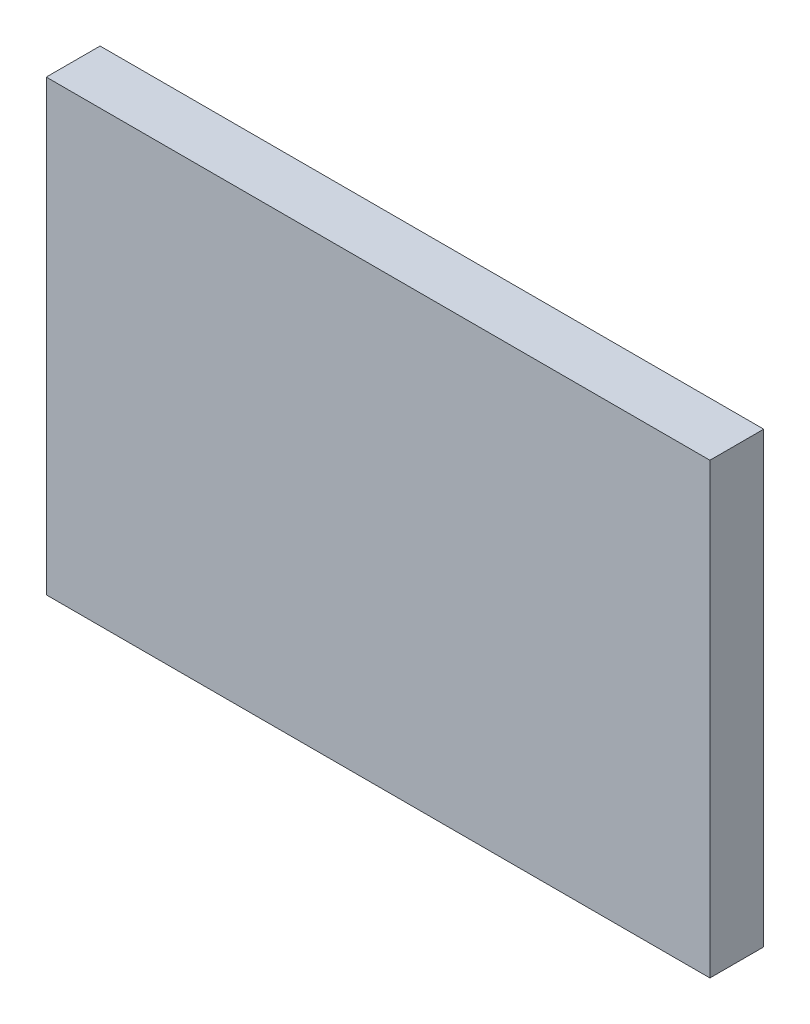
ISO-10303-21;
HEADER;
FILE_DESCRIPTION(('STEP AP214'),'2;1');
FILE_NAME('part.step','',(''),(''),'','','');
FILE_SCHEMA(('AUTOMOTIVE_DESIGN { 1 0 10303 214 1 1 1 1 }'));
ENDSEC;
DATA;
#1=APPLICATION_CONTEXT('core data for automotive mechanical design processes');
#2=APPLICATION_PROTOCOL_DEFINITION('international standard','automotive_design',2000,#1);
#3=PRODUCT_CONTEXT('',#1,'mechanical');
#4=PRODUCT('Part','Part','',(#3));
#5=PRODUCT_RELATED_PRODUCT_CATEGORY('part','',(#4));
#6=PRODUCT_DEFINITION_FORMATION('','',#4);
#7=PRODUCT_DEFINITION_CONTEXT('part definition',#1,'design');
#8=PRODUCT_DEFINITION('design','',#6,#7);
#9=PRODUCT_DEFINITION_SHAPE('','',#8);
#10=(LENGTH_UNIT() NAMED_UNIT(*) SI_UNIT(.MILLI.,.METRE.));
#11=(NAMED_UNIT(*) PLANE_ANGLE_UNIT() SI_UNIT($,.RADIAN.));
#12=(NAMED_UNIT(*) SI_UNIT($,.STERADIAN.) SOLID_ANGLE_UNIT());
#13=UNCERTAINTY_MEASURE_WITH_UNIT(LENGTH_MEASURE(1.E-05),#10,'distance_accuracy_value','');
#14=(GEOMETRIC_REPRESENTATION_CONTEXT(3) GLOBAL_UNCERTAINTY_ASSIGNED_CONTEXT((#13)) GLOBAL_UNIT_ASSIGNED_CONTEXT((#10,
#11,#12)) REPRESENTATION_CONTEXT('',''));
#15=CARTESIAN_POINT('',(0.,0.,0.));
#16=DIRECTION('',(0.,0.,1.));
#17=DIRECTION('',(1.,0.,0.));
#18=AXIS2_PLACEMENT_3D('',#15,#16,#17);
#19=CARTESIAN_POINT('',(37.,-25.,6.));
#20=DIRECTION('',(-1.,0.,0.));
#21=DIRECTION('',(0.,0.,1.));
#22=AXIS2_PLACEMENT_3D('',#19,#20,#21);
#23=PLANE('',#22);
#24=DIRECTION('',(0.,1.,0.));
#25=VECTOR('',#24,1.);
#26=CARTESIAN_POINT('',(37.,-25.,0.));
#27=LINE('',#26,#25);
#28=CARTESIAN_POINT('',(37.,-25.,0.));
#29=VERTEX_POINT('',#28);
#30=CARTESIAN_POINT('',(37.,25.,0.));
#31=VERTEX_POINT('',#30);
#32=EDGE_CURVE('E96',#29,#31,#27,.T.);
#33=ORIENTED_EDGE('',*,*,#32,.T.);
#34=DIRECTION('',(0.,0.,-1.));
#35=VECTOR('',#34,1.);
#36=CARTESIAN_POINT('',(37.,25.,6.));
#37=LINE('',#36,#35);
#38=CARTESIAN_POINT('',(37.,25.,6.));
#39=VERTEX_POINT('',#38);
#40=EDGE_CURVE('E11',#39,#31,#37,.T.);
#41=ORIENTED_EDGE('',*,*,#40,.F.);
#42=DIRECTION('',(0.,1.,0.));
#43=VECTOR('',#42,1.);
#44=CARTESIAN_POINT('',(37.,-25.,6.));
#45=LINE('',#44,#43);
#46=CARTESIAN_POINT('',(37.,-25.,6.));
#47=VERTEX_POINT('',#46);
#48=EDGE_CURVE('E84',#47,#39,#45,.T.);
#49=ORIENTED_EDGE('',*,*,#48,.F.);
#50=DIRECTION('',(0.,0.,-1.));
#51=VECTOR('',#50,1.);
#52=CARTESIAN_POINT('',(37.,-25.,6.));
#53=LINE('',#52,#51);
#54=EDGE_CURVE('E92',#47,#29,#53,.T.);
#55=ORIENTED_EDGE('',*,*,#54,.T.);
#56=EDGE_LOOP('',(#33,#41,#49,#55));
#57=FACE_BOUND('',#56,.T.);
#58=ADVANCED_FACE('F33',(#57),#23,.F.);
#59=CARTESIAN_POINT('',(-37.,25.,6.));
#60=DIRECTION('',(0.,-1.,0.));
#61=DIRECTION('',(0.,0.,-1.));
#62=AXIS2_PLACEMENT_3D('',#59,#60,#61);
#63=PLANE('',#62);
#64=DIRECTION('',(-1.,0.,0.));
#65=VECTOR('',#64,1.);
#66=CARTESIAN_POINT('',(-37.,25.,0.));
#67=LINE('',#66,#65);
#68=CARTESIAN_POINT('',(-37.,25.,0.));
#69=VERTEX_POINT('',#68);
#70=EDGE_CURVE('E88',#31,#69,#67,.T.);
#71=ORIENTED_EDGE('',*,*,#70,.T.);
#72=DIRECTION('',(0.,0.,-1.));
#73=VECTOR('',#72,1.);
#74=CARTESIAN_POINT('',(-37.,25.,6.));
#75=LINE('',#74,#73);
#76=CARTESIAN_POINT('',(-37.,25.,6.));
#77=VERTEX_POINT('',#76);
#78=EDGE_CURVE('E41',#77,#69,#75,.T.);
#79=ORIENTED_EDGE('',*,*,#78,.F.);
#80=DIRECTION('',(-1.,0.,0.));
#81=VECTOR('',#80,1.);
#82=CARTESIAN_POINT('',(-37.,25.,6.));
#83=LINE('',#82,#81);
#84=EDGE_CURVE('E79',#39,#77,#83,.T.);
#85=ORIENTED_EDGE('',*,*,#84,.F.);
#86=ORIENTED_EDGE('',*,*,#40,.T.);
#87=EDGE_LOOP('',(#71,#79,#85,#86));
#88=FACE_BOUND('',#87,.T.);
#89=ADVANCED_FACE('F87',(#88),#63,.F.);
#90=CARTESIAN_POINT('',(-37.,-25.,6.));
#91=DIRECTION('',(1.,0.,0.));
#92=DIRECTION('',(0.,0.,-1.));
#93=AXIS2_PLACEMENT_3D('',#90,#91,#92);
#94=PLANE('',#93);
#95=DIRECTION('',(0.,-1.,0.));
#96=VECTOR('',#95,1.);
#97=CARTESIAN_POINT('',(-37.,-25.,0.));
#98=LINE('',#97,#96);
#99=CARTESIAN_POINT('',(-37.,-25.,0.));
#100=VERTEX_POINT('',#99);
#101=EDGE_CURVE('E66',#69,#100,#98,.T.);
#102=ORIENTED_EDGE('',*,*,#101,.T.);
#103=DIRECTION('',(0.,0.,-1.));
#104=VECTOR('',#103,1.);
#105=CARTESIAN_POINT('',(-37.,-25.,6.));
#106=LINE('',#105,#104);
#107=CARTESIAN_POINT('',(-37.,-25.,6.));
#108=VERTEX_POINT('',#107);
#109=EDGE_CURVE('E89',#108,#100,#106,.T.);
#110=ORIENTED_EDGE('',*,*,#109,.F.);
#111=DIRECTION('',(0.,-1.,0.));
#112=VECTOR('',#111,1.);
#113=CARTESIAN_POINT('',(-37.,-25.,6.));
#114=LINE('',#113,#112);
#115=EDGE_CURVE('E82',#77,#108,#114,.T.);
#116=ORIENTED_EDGE('',*,*,#115,.F.);
#117=ORIENTED_EDGE('',*,*,#78,.T.);
#118=EDGE_LOOP('',(#102,#110,#116,#117));
#119=FACE_BOUND('',#118,.T.);
#120=ADVANCED_FACE('F90',(#119),#94,.F.);
#121=CARTESIAN_POINT('',(-37.,-25.,6.));
#122=DIRECTION('',(0.,1.,0.));
#123=DIRECTION('',(0.,0.,1.));
#124=AXIS2_PLACEMENT_3D('',#121,#122,#123);
#125=PLANE('',#124);
#126=DIRECTION('',(1.,0.,0.));
#127=VECTOR('',#126,1.);
#128=CARTESIAN_POINT('',(-37.,-25.,0.));
#129=LINE('',#128,#127);
#130=EDGE_CURVE('E72',#100,#29,#129,.T.);
#131=ORIENTED_EDGE('',*,*,#130,.T.);
#132=ORIENTED_EDGE('',*,*,#54,.F.);
#133=DIRECTION('',(1.,0.,0.));
#134=VECTOR('',#133,1.);
#135=CARTESIAN_POINT('',(-37.,-25.,6.));
#136=LINE('',#135,#134);
#137=EDGE_CURVE('E49',#108,#47,#136,.T.);
#138=ORIENTED_EDGE('',*,*,#137,.F.);
#139=ORIENTED_EDGE('',*,*,#109,.T.);
#140=EDGE_LOOP('',(#131,#132,#138,#139));
#141=FACE_BOUND('',#140,.T.);
#142=ADVANCED_FACE('F103',(#141),#125,.F.);
#143=CARTESIAN_POINT('',(0.,0.,6.));
#144=DIRECTION('',(0.,0.,-1.));
#145=DIRECTION('',(-1.,0.,0.));
#146=AXIS2_PLACEMENT_3D('',#143,#144,#145);
#147=PLANE('',#146);
#148=ORIENTED_EDGE('',*,*,#48,.T.);
#149=ORIENTED_EDGE('',*,*,#84,.T.);
#150=ORIENTED_EDGE('',*,*,#115,.T.);
#151=ORIENTED_EDGE('',*,*,#137,.T.);
#152=EDGE_LOOP('',(#148,#149,#150,#151));
#153=FACE_BOUND('',#152,.T.);
#154=ADVANCED_FACE('F80',(#153),#147,.F.);
#155=CARTESIAN_POINT('',(0.,0.,0.));
#156=DIRECTION('',(0.,0.,-1.));
#157=DIRECTION('',(-1.,0.,0.));
#158=AXIS2_PLACEMENT_3D('',#155,#156,#157);
#159=PLANE('',#158);
#160=ORIENTED_EDGE('',*,*,#32,.F.);
#161=ORIENTED_EDGE('',*,*,#130,.F.);
#162=ORIENTED_EDGE('',*,*,#101,.F.);
#163=ORIENTED_EDGE('',*,*,#70,.F.);
#164=EDGE_LOOP('',(#160,#161,#162,#163));
#165=FACE_BOUND('',#164,.T.);
#166=ADVANCED_FACE('F106',(#165),#159,.T.);
#167=CLOSED_SHELL('',(#58,#89,#120,#142,#154,#166));
#168=MANIFOLD_SOLID_BREP('B2',#167);
#169=ADVANCED_BREP_SHAPE_REPRESENTATION('',(#18,#168),#14);
#170=SHAPE_DEFINITION_REPRESENTATION(#9,#169);
ENDSEC;
END-ISO-10303-21;
